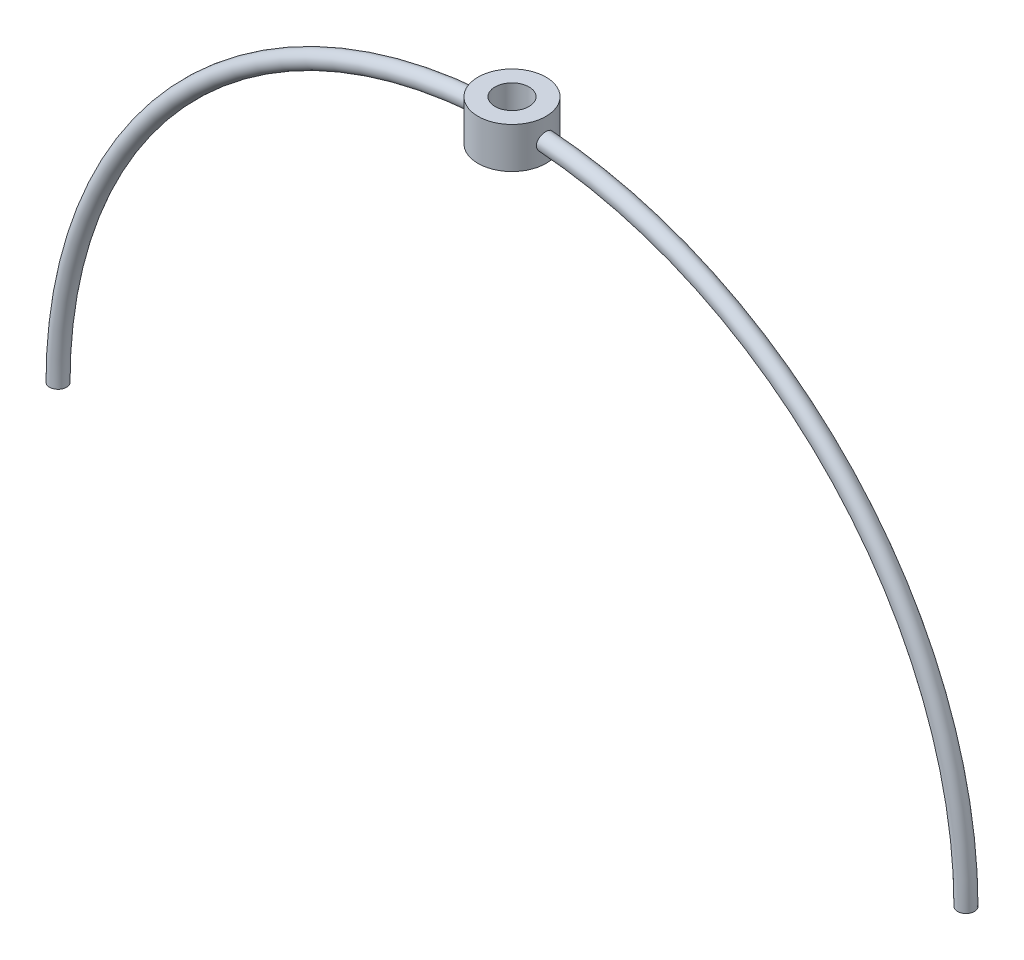
ISO-10303-21;
HEADER;
FILE_DESCRIPTION(('STEP AP214'),'2;1');
FILE_NAME('part.step','',(''),(''),'','','');
FILE_SCHEMA(('AUTOMOTIVE_DESIGN { 1 0 10303 214 1 1 1 1 }'));
ENDSEC;
DATA;
#1=APPLICATION_CONTEXT('core data for automotive mechanical design processes');
#2=APPLICATION_PROTOCOL_DEFINITION('international standard','automotive_design',2000,#1);
#3=PRODUCT_CONTEXT('',#1,'mechanical');
#4=PRODUCT('Part','Part','',(#3));
#5=PRODUCT_RELATED_PRODUCT_CATEGORY('part','',(#4));
#6=PRODUCT_DEFINITION_FORMATION('','',#4);
#7=PRODUCT_DEFINITION_CONTEXT('part definition',#1,'design');
#8=PRODUCT_DEFINITION('design','',#6,#7);
#9=PRODUCT_DEFINITION_SHAPE('','',#8);
#10=(LENGTH_UNIT() NAMED_UNIT(*) SI_UNIT(.MILLI.,.METRE.));
#11=(NAMED_UNIT(*) PLANE_ANGLE_UNIT() SI_UNIT($,.RADIAN.));
#12=(NAMED_UNIT(*) SI_UNIT($,.STERADIAN.) SOLID_ANGLE_UNIT());
#13=UNCERTAINTY_MEASURE_WITH_UNIT(LENGTH_MEASURE(1.E-05),#10,'distance_accuracy_value','');
#14=(GEOMETRIC_REPRESENTATION_CONTEXT(3) GLOBAL_UNCERTAINTY_ASSIGNED_CONTEXT((#13)) GLOBAL_UNIT_ASSIGNED_CONTEXT((#10,
#11,#12)) REPRESENTATION_CONTEXT('',''));
#15=CARTESIAN_POINT('',(0.,0.,0.));
#16=DIRECTION('',(0.,0.,1.));
#17=DIRECTION('',(1.,0.,0.));
#18=AXIS2_PLACEMENT_3D('',#15,#16,#17);
#19=CARTESIAN_POINT('',(0.,-267.,0.));
#20=DIRECTION('',(0.,0.,1.));
#21=DIRECTION('',(1.,0.,0.));
#22=AXIS2_PLACEMENT_3D('',#19,#20,#21);
#23=TOROIDAL_SURFACE('',#22,267.,5.);
#24=CARTESIAN_POINT('',(-19.8558566792347,-5.13977478826469,-2.3968636869233));
#25=CARTESIAN_POINT('',(-19.8843940932087,-5.27144782380629,-2.16043604334639));
#26=CARTESIAN_POINT('',(-19.9099552493875,-5.38402838862671,-1.91296021142055));
#27=CARTESIAN_POINT('',(-19.9524300650434,-5.56725920877616,-1.4021924342394));
#28=CARTESIAN_POINT('',(-19.9693436731426,-5.63790921498252,-1.13890039502525));
#29=CARTESIAN_POINT('',(-19.9926914503923,-5.73472992191784,-0.603439630688587));
#30=CARTESIAN_POINT('',(-19.9991129390298,-5.76084680268452,-0.331260569350999));
#31=CARTESIAN_POINT('',(-20.0007142002762,-5.76739464470261,0.213664533436598));
#32=CARTESIAN_POINT('',(-19.9958948597249,-5.74782921003758,0.486410528462484));
#33=CARTESIAN_POINT('',(-19.97574119007,-5.66454892712558,1.01968767412072));
#34=CARTESIAN_POINT('',(-19.9605939038465,-5.60161920966567,1.28034943861564));
#35=CARTESIAN_POINT('',(-19.9215886245904,-5.43471906347671,1.78747011195748));
#36=CARTESIAN_POINT('',(-19.8977296385545,-5.33074395607818,2.03392739799711));
#37=CARTESIAN_POINT('',(-19.8431690347108,-5.08252849794351,2.51150991578537));
#38=CARTESIAN_POINT('',(-19.8123332902194,-4.93748257006901,2.74220028562752));
#39=CARTESIAN_POINT('',(-19.7472904620689,-4.61242002357268,3.17693551524105));
#40=CARTESIAN_POINT('',(-19.7130825317093,-4.43239461110178,3.38097365302074));
#41=CARTESIAN_POINT('',(-19.6432111099157,-4.03333947935033,3.76620966366136));
#42=CARTESIAN_POINT('',(-19.6075511057081,-3.81292312182426,3.94597376658238));
#43=CARTESIAN_POINT('',(-19.540260501096,-3.34490547491386,4.26675089871441));
#44=CARTESIAN_POINT('',(-19.5086304166132,-3.09730071233345,4.40775896893843));
#45=CARTESIAN_POINT('',(-19.452615617225,-2.57747651579863,4.64880292734323));
#46=CARTESIAN_POINT('',(-19.4283470218217,-2.30494289757578,4.74819072872175));
#47=CARTESIAN_POINT('',(-19.3907716220888,-1.74626298778563,4.89940107800401));
#48=CARTESIAN_POINT('',(-19.3774622380502,-1.46011991655706,4.95123482007417));
#49=CARTESIAN_POINT('',(-19.3638235500661,-0.891517802991517,5.00430514031102));
#50=CARTESIAN_POINT('',(-19.3631173911493,-0.609205139358788,5.00701076495249));
#51=CARTESIAN_POINT('',(-19.3739253320875,-0.0483796352364415,4.96502619139632));
#52=CARTESIAN_POINT('',(-19.3854374247142,0.230133821779043,4.92034377816018));
#53=CARTESIAN_POINT('',(-19.4188579051637,0.767228158505235,4.78669864943589));
#54=CARTESIAN_POINT('',(-19.4404630359377,1.0261500042631,4.69902409791456));
#55=CARTESIAN_POINT('',(-19.4915065053394,1.52536190777954,4.4825742242148));
#56=CARTESIAN_POINT('',(-19.5209453190069,1.76565083448394,4.3537964094126));
#57=CARTESIAN_POINT('',(-19.5846846874444,2.22331108550638,4.05748780135106));
#58=CARTESIAN_POINT('',(-19.6190256473304,2.44046274210971,3.88962678147381));
#59=CARTESIAN_POINT('',(-19.6886300353149,2.84393843135892,3.52038028620137));
#60=CARTESIAN_POINT('',(-19.7238935776284,3.03025862598368,3.31899064328233));
#61=CARTESIAN_POINT('',(-19.7923269616899,3.37109331148008,2.88329385028154));
#62=CARTESIAN_POINT('',(-19.8254345443517,3.52482745551869,2.64836575305738));
#63=CARTESIAN_POINT('',(-19.8850574750467,3.79114838782194,2.1554685066568));
#64=CARTESIAN_POINT('',(-19.9115728753803,3.90373550253765,1.89749954030154));
#65=CARTESIAN_POINT('',(-19.9551087424337,4.0846535678416,1.36558132687681));
#66=CARTESIAN_POINT('',(-19.9721252409761,4.15296602455607,1.09162545396528));
#67=CARTESIAN_POINT('',(-19.9947574865877,4.243229279869,0.535729779044491));
#68=CARTESIAN_POINT('',(-20.0003743423394,4.26518458698272,0.253790756148281));
#69=CARTESIAN_POINT('',(-19.9995919738042,4.26210147609131,-0.3058449866098));
#70=CARTESIAN_POINT('',(-19.9933600504573,4.23771735815012,-0.583545784179696));
#71=CARTESIAN_POINT('',(-19.9698875135685,4.14397061551274,-1.13075994715954));
#72=CARTESIAN_POINT('',(-19.9526468254636,4.07460768617214,-1.40027325710215));
#73=CARTESIAN_POINT('',(-19.9090223758569,3.89293056585302,-1.92347890687889));
#74=CARTESIAN_POINT('',(-19.8826423423211,3.78063388574783,-2.1771776478127));
#75=CARTESIAN_POINT('',(-19.8235530341666,3.51613038192599,-2.66204220179236));
#76=CARTESIAN_POINT('',(-19.7908430899126,3.36391933510132,-2.89320562695465));
#77=CARTESIAN_POINT('',(-19.7221039727865,3.02111982695617,-3.32989856992594));
#78=CARTESIAN_POINT('',(-19.6860346398477,2.83002246653072,-3.53502254096838));
#79=CARTESIAN_POINT('',(-19.614981547484,2.41578398422171,-3.91011860453887));
#80=CARTESIAN_POINT('',(-19.5799978044162,2.19264237979864,-4.08009016762894));
#81=CARTESIAN_POINT('',(-19.515073359117,1.72000075156805,-4.38013505953025));
#82=CARTESIAN_POINT('',(-19.4851371029088,1.47047780152085,-4.51017329544998));
#83=CARTESIAN_POINT('',(-19.4338756142997,0.952227026667946,-4.72619228216156));
#84=CARTESIAN_POINT('',(-19.4125487878018,0.683502767976308,-4.81218118979327));
#85=CARTESIAN_POINT('',(-19.3813903626495,0.140660645514759,-4.93616664658288));
#86=CARTESIAN_POINT('',(-19.3713218364114,-0.133217616795741,-4.97515376938546));
#87=CARTESIAN_POINT('',(-19.3629763332636,-0.683807668266718,-5.00753851779471));
#88=CARTESIAN_POINT('',(-19.3646984922077,-0.960519248287473,-5.00093948443705));
#89=CARTESIAN_POINT('',(-19.3795429035588,-1.50619822651781,-4.94309186973727));
#90=CARTESIAN_POINT('',(-19.3925561797823,-1.7752143337346,-4.89227009066053));
#91=CARTESIAN_POINT('',(-19.4282580819616,-2.30107995553048,-4.74849648126612));
#92=CARTESIAN_POINT('',(-19.450948882073,-2.55792672172594,-4.65553518357602));
#93=CARTESIAN_POINT('',(-19.5041832379835,-3.05969893109056,-4.42728863292985));
#94=CARTESIAN_POINT('',(-19.5349232799862,-3.3041113445727,-4.29092275335443));
#95=CARTESIAN_POINT('',(-19.6005197321358,-3.76706750666961,-3.98054025538962));
#96=CARTESIAN_POINT('',(-19.6353757302926,-3.98561383999376,-3.80652740385659));
#97=CARTESIAN_POINT('',(-19.7029770007677,-4.3768311282681,-3.43876083262377));
#98=CARTESIAN_POINT('',(-19.7356960793594,-4.55165934692548,-3.24729132827937));
#99=CARTESIAN_POINT('',(-19.7984718618213,-4.87008330020921,-2.83954407374087));
#100=CARTESIAN_POINT('',(-19.8285289150108,-5.01368313633007,-2.62326958710629));
#101=CARTESIAN_POINT('',(-19.8558566792347,-5.13977478826469,-2.3968636869233));
#102=B_SPLINE_CURVE_WITH_KNOTS('',3,(#24,#25,#26,#27,#28,#29,#30,#31,#32,#33,#34,#35,#36,#37,
#38,#39,#40,#41,#42,#43,#44,#45,#46,#47,#48,#49,#50,#51,#52,#53,#54,#55,#56,#57,#58,#59,#60,#61,
#62,#63,#64,#65,#66,#67,#68,#69,#70,#71,#72,#73,#74,#75,#76,#77,#78,#79,#80,#81,#82,#83,#84,#85,
#86,#87,#88,#89,#90,#91,#92,#93,#94,#95,#96,#97,#98,#99,#100,#101),.UNSPECIFIED.,.T.,.F.,(4,2,2,
2,2,2,2,2,2,2,2,2,2,2,2,2,2,2,2,2,2,2,2,2,2,2,2,2,2,2,2,2,2,2,2,2,2,2,4),(0.,0.815492485813612,
1.63098981667689,2.44747201013743,3.26388978981821,4.06590146330171,4.86800458265879,
5.68708286511368,6.50636733105496,7.3623759281503,8.21849400397939,9.08748750742063,
9.95627639834583,10.7990422006925,11.6416695739446,12.4604641708282,13.2793084312814,
14.1053399619844,14.9314742430981,15.7755858799662,16.6196908197013,17.4641481218718,
18.3085232916405,19.1410646258288,19.9736115989327,20.8058193727155,21.6381152331355,
22.4820985845795,23.3260946465131,24.1708302926918,25.0154094582459,25.8418590316785,
26.6682480347879,27.4867487652216,28.3054334772254,29.1463466892656,29.9871758006368,
30.7682036650913,31.5491288883426),.UNSPECIFIED.);
#103=CARTESIAN_POINT('',(-19.8558566792347,-5.13977478826469,-2.3968636869233));
#104=VERTEX_POINT('',#103);
#105=EDGE_CURVE('E114',#104,#104,#102,.T.);
#106=ORIENTED_EDGE('',*,*,#105,.T.);
#107=EDGE_LOOP('',(#106));
#108=FACE_BOUND('',#107,.T.);
#109=CARTESIAN_POINT('',(-267.,-267.,0.));
#110=DIRECTION('',(0.,1.,0.));
#111=DIRECTION('',(0.,0.,-1.));
#112=AXIS2_PLACEMENT_3D('',#109,#110,#111);
#113=CIRCLE('',#112,5.);
#114=CARTESIAN_POINT('',(-267.,-267.,-5.));
#115=VERTEX_POINT('',#114);
#116=EDGE_CURVE('E66',#115,#115,#113,.T.);
#117=ORIENTED_EDGE('',*,*,#116,.T.);
#118=EDGE_LOOP('',(#117));
#119=FACE_BOUND('',#118,.T.);
#120=ADVANCED_FACE('F39',(#108,#119),#23,.T.);
#121=CARTESIAN_POINT('',(0.,-267.,0.));
#122=DIRECTION('',(0.,0.,1.));
#123=DIRECTION('',(1.,0.,0.));
#124=AXIS2_PLACEMENT_3D('',#121,#122,#123);
#125=TOROIDAL_SURFACE('',#124,267.,3.);
#126=CARTESIAN_POINT('',(-19.9444777476599,-3.35758524978057,-1.48923046339338));
#127=CARTESIAN_POINT('',(-19.9334674717532,-3.27219185162063,-1.63666877254863));
#128=CARTESIAN_POINT('',(-19.9213461594175,-3.17418069360779,-1.77684558395535));
#129=CARTESIAN_POINT('',(-19.8962543259344,-2.95590010042962,-2.03873980847371));
#130=CARTESIAN_POINT('',(-19.8832827782903,-2.83560342758394,-2.16043429737974));
#131=CARTESIAN_POINT('',(-19.8579728896269,-2.57636843660325,-2.38187765962171));
#132=CARTESIAN_POINT('',(-19.8456340486863,-2.43744515975818,-2.48164407044328));
#133=CARTESIAN_POINT('',(-19.8229755436596,-2.14479298846647,-2.6565864609076));
#134=CARTESIAN_POINT('',(-19.8126553585246,-1.99106792993525,-2.73176878948775));
#135=CARTESIAN_POINT('',(-19.7951832165943,-1.67243989864651,-2.85563880671687));
#136=CARTESIAN_POINT('',(-19.7880432718991,-1.50749721335644,-2.90422619896277));
#137=CARTESIAN_POINT('',(-19.7778420900555,-1.17165152700827,-2.97290878360131));
#138=CARTESIAN_POINT('',(-19.7747806871847,-1.00074876841401,-2.99300513366594));
#139=CARTESIAN_POINT('',(-19.773134495077,-0.66016070583637,-3.00386111066936));
#140=CARTESIAN_POINT('',(-19.7744934266305,-0.490487448330443,-2.99498954833695));
#141=CARTESIAN_POINT('',(-19.7814296834904,-0.155144063511982,-2.94882631130559));
#142=CARTESIAN_POINT('',(-19.787006704001,0.0105263521502106,-2.91153669007183));
#143=CARTESIAN_POINT('',(-19.8016549511313,0.331082968983564,-2.81016492375275));
#144=CARTESIAN_POINT('',(-19.8106832938964,0.486075005909743,-2.74641080559001));
#145=CARTESIAN_POINT('',(-19.8312216570137,0.783071034003262,-2.5939423571745));
#146=CARTESIAN_POINT('',(-19.8427316993711,0.925074909989715,-2.50522780559743));
#147=CARTESIAN_POINT('',(-19.86695985771,1.19233660133368,-2.3052187821512));
#148=CARTESIAN_POINT('',(-19.8796795028743,1.31757272429994,-2.19389552096793));
#149=CARTESIAN_POINT('',(-19.9048990094883,1.54768033380063,-1.95186286650414));
#150=CARTESIAN_POINT('',(-19.9173988625749,1.65255104694485,-1.82115273732653));
#151=CARTESIAN_POINT('',(-19.940875598928,1.83971272867435,-1.54306446388304));
#152=CARTESIAN_POINT('',(-19.9518418696701,1.92184986952628,-1.39558185902703));
#153=CARTESIAN_POINT('',(-19.9709311458209,2.06036609375574,-1.08880835991596));
#154=CARTESIAN_POINT('',(-19.9790541530138,2.11674519329721,-0.929517473071026));
#155=CARTESIAN_POINT('',(-19.9915589534151,2.2022239436843,-0.603482163728312));
#156=CARTESIAN_POINT('',(-19.9959374294645,2.23129940935435,-0.436731269951043));
#157=CARTESIAN_POINT('',(-20.0004525302974,2.2612687100837,-0.100660753845513));
#158=CARTESIAN_POINT('',(-20.0005892270132,2.26216302303904,0.0686588248742689));
#159=CARTESIAN_POINT('',(-19.9966112488473,2.23578218475202,0.404579233724547));
#160=CARTESIAN_POINT('',(-19.9925079590123,2.20858247057831,0.571186130721185));
#161=CARTESIAN_POINT('',(-19.980522687774,2.1268875918843,0.897425769633702));
#162=CARTESIAN_POINT('',(-19.972640655909,2.07239206285191,1.05705841838355));
#163=CARTESIAN_POINT('',(-19.9539625420232,1.93754455280067,1.36499796869973));
#164=CARTESIAN_POINT('',(-19.9431636873192,1.85716795563044,1.51329392080909));
#165=CARTESIAN_POINT('',(-19.9198554304926,1.67277114856174,1.79422884168375));
#166=CARTESIAN_POINT('',(-19.9073459916294,1.56875043079399,1.92686747404109));
#167=CARTESIAN_POINT('',(-19.8819844919911,1.33964275839593,2.17303251159056));
#168=CARTESIAN_POINT('',(-19.8691317192539,1.21450861520785,2.28651494024865));
#169=CARTESIAN_POINT('',(-19.8445642050143,0.946800542265269,2.49076002155908));
#170=CARTESIAN_POINT('',(-19.8328494272717,0.804227168202392,2.58152339786107));
#171=CARTESIAN_POINT('',(-19.8119333773113,0.506218761255956,2.73742351309653));
#172=CARTESIAN_POINT('',(-19.8027227297931,0.350834621984267,2.8026562520795));
#173=CARTESIAN_POINT('',(-19.7878037660019,0.0311704361326679,2.90612749266802));
#174=CARTESIAN_POINT('',(-19.782095261391,-0.133109131552715,2.94436744590529));
#175=CARTESIAN_POINT('',(-19.7748437105285,-0.464799091921624,2.99268393478277));
#176=CARTESIAN_POINT('',(-19.7732750409593,-0.63218373723768,3.00293372802264));
#177=CARTESIAN_POINT('',(-19.7743841040748,-0.966324113993612,2.99562078167413));
#178=CARTESIAN_POINT('',(-19.7770619247008,-1.13307983233724,2.97805746609936));
#179=CARTESIAN_POINT('',(-19.78635785679,-1.46200532124528,2.9156523246265));
#180=CARTESIAN_POINT('',(-19.7929923870801,-1.62415301625277,2.87069681467451));
#181=CARTESIAN_POINT('',(-19.8094535898927,-1.93871095779186,2.75480517750938));
#182=CARTESIAN_POINT('',(-19.8192805808835,-2.0911202310375,2.68386645821436));
#183=CARTESIAN_POINT('',(-19.8411959595285,-2.38427719659041,2.51676824987635));
#184=CARTESIAN_POINT('',(-19.8533157996762,-2.52481779376118,2.42024943205852));
#185=CARTESIAN_POINT('',(-19.8783565456399,-2.78778023448153,2.20513840577177));
#186=CARTESIAN_POINT('',(-19.8912775057705,-2.91020084761719,2.08654469956957));
#187=CARTESIAN_POINT('',(-19.9165664271559,-3.13424333236444,1.82951987926658));
#188=CARTESIAN_POINT('',(-19.928929744823,-3.23570934571231,1.69095227577018));
#189=CARTESIAN_POINT('',(-19.9515878461411,-3.41361743286353,1.39843547934434));
#190=CARTESIAN_POINT('',(-19.9618828768752,-3.49006249642335,1.24448812701441));
#191=CARTESIAN_POINT('',(-19.9790864509289,-3.6145636356622,0.927832003383753));
#192=CARTESIAN_POINT('',(-19.9860405548795,-3.66300359417857,0.765276773480945));
#193=CARTESIAN_POINT('',(-19.9959727935167,-3.73150696886169,0.434143339196063));
#194=CARTESIAN_POINT('',(-19.9989507140813,-3.75156885683994,0.265564810954282));
#195=CARTESIAN_POINT('',(-20.0005664158284,-3.76249694562767,-0.0689918899567632));
#196=CARTESIAN_POINT('',(-19.999293865613,-3.75396632517443,-0.234950497894562));
#197=CARTESIAN_POINT('',(-19.9927480475352,-3.70932209423292,-0.562911463384697));
#198=CARTESIAN_POINT('',(-19.9874788543338,-3.67323657628611,-0.72491767696589));
#199=CARTESIAN_POINT('',(-19.9758458539948,-3.59103708862254,-0.988358866905755));
#200=CARTESIAN_POINT('',(-19.9704156170496,-3.55215135753872,-1.09215474137977));
#201=CARTESIAN_POINT('',(-19.9583055949413,-3.46314487378962,-1.2947307567935));
#202=CARTESIAN_POINT('',(-19.9516258130925,-3.4130241509247,-1.39351091103636));
#203=CARTESIAN_POINT('',(-19.9444777476599,-3.35758524978057,-1.48923046339338));
#204=B_SPLINE_CURVE_WITH_KNOTS('',3,(#126,#127,#128,#129,#130,#131,#132,#133,#134,#135,#136,
#137,#138,#139,#140,#141,#142,#143,#144,#145,#146,#147,#148,#149,#150,#151,#152,#153,#154,#155,
#156,#157,#158,#159,#160,#161,#162,#163,#164,#165,#166,#167,#168,#169,#170,#171,#172,#173,#174,
#175,#176,#177,#178,#179,#180,#181,#182,#183,#184,#185,#186,#187,#188,#189,#190,#191,#192,#193,
#194,#195,#196,#197,#198,#199,#200,#201,#202,#203),.UNSPECIFIED.,.T.,.F.,(4,2,2,2,2,2,2,2,2,2,2,
2,2,2,2,2,2,2,2,2,2,2,2,2,2,2,2,2,2,2,2,2,2,2,2,2,2,2,4),(0.,0.511803208231407,1.02423612689562,
1.53625771209649,2.04814696105178,2.56195360495626,3.07573937083885,3.58300940250913,
4.09024278274577,4.59136835186553,5.09249836460848,5.59427054938984,6.09606178558466,
6.60116972785299,7.10627735315038,7.61183197482302,8.11737802329486,8.62157011790308,
9.12576894574203,9.63044875368201,10.1351394030313,10.6409733526747,11.1467911883911,
11.6506883473374,12.1545584053818,12.6553023881117,13.1560567409695,13.6589036334203,
14.161800703486,14.6721754543059,15.1825848455754,15.6966637781808,16.210681260985,
16.7174746824968,17.2242953943207,17.720492236814,18.2161838751066,18.5484564317384,
18.880728107041),.UNSPECIFIED.);
#205=CARTESIAN_POINT('',(-19.9444777476599,-3.35758524978057,-1.48923046339338));
#206=VERTEX_POINT('',#205);
#207=EDGE_CURVE('E44',#206,#206,#204,.T.);
#208=ORIENTED_EDGE('',*,*,#207,.T.);
#209=EDGE_LOOP('',(#208));
#210=FACE_BOUND('',#209,.T.);
#211=CARTESIAN_POINT('',(-267.,-267.,0.));
#212=DIRECTION('',(0.,1.,0.));
#213=DIRECTION('',(0.,0.,-1.));
#214=AXIS2_PLACEMENT_3D('',#211,#212,#213);
#215=CIRCLE('',#214,3.);
#216=CARTESIAN_POINT('',(-267.,-267.,-3.));
#217=VERTEX_POINT('',#216);
#218=EDGE_CURVE('E11',#217,#217,#215,.F.);
#219=ORIENTED_EDGE('',*,*,#218,.T.);
#220=EDGE_LOOP('',(#219));
#221=FACE_BOUND('',#220,.T.);
#222=ADVANCED_FACE('F73',(#210,#221),#125,.F.);
#223=CARTESIAN_POINT('',(-267.,-267.,0.));
#224=DIRECTION('',(0.,1.,0.));
#225=DIRECTION('',(0.,0.,-1.));
#226=AXIS2_PLACEMENT_3D('',#223,#224,#225);
#227=PLANE('',#226);
#228=ORIENTED_EDGE('',*,*,#218,.F.);
#229=EDGE_LOOP('',(#228));
#230=FACE_BOUND('',#229,.T.);
#231=ORIENTED_EDGE('',*,*,#116,.F.);
#232=EDGE_LOOP('',(#231));
#233=FACE_BOUND('',#232,.T.);
#234=ADVANCED_FACE('F75',(#230,#233),#227,.F.);
#235=CARTESIAN_POINT('',(0.,-12.,0.));
#236=DIRECTION('',(0.,1.,0.));
#237=DIRECTION('',(0.,0.,1.));
#238=AXIS2_PLACEMENT_3D('',#235,#236,#237);
#239=CYLINDRICAL_SURFACE('',#238,20.);
#240=ORIENTED_EDGE('',*,*,#207,.F.);
#241=EDGE_LOOP('',(#240));
#242=FACE_BOUND('',#241,.T.);
#243=ADVANCED_FACE('F77',(#242),#239,.T.);
#244=CARTESIAN_POINT('',(19.8558566792347,-5.1397747882647,-2.39686368692331));
#245=CARTESIAN_POINT('',(19.8407457925973,-5.0700538176607,-2.52205040445424));
#246=CARTESIAN_POINT('',(19.8248055866448,-4.9949932380026,-2.64412713302455));
#247=CARTESIAN_POINT('',(19.7917235166022,-4.83480311734881,-2.88132504920793));
#248=CARTESIAN_POINT('',(19.7745813681774,-4.74967119055283,-2.99644457893372));
#249=CARTESIAN_POINT('',(19.7220503496396,-4.47998955399404,-3.33037739952749));
#250=CARTESIAN_POINT('',(19.6855583873272,-4.28116053074759,-3.53775323557462));
#251=CARTESIAN_POINT('',(19.6138270852357,-3.85172703552723,-3.91599086853255));
#252=CARTESIAN_POINT('',(19.5785865887783,-3.62115291936987,-4.08688715504977));
#253=CARTESIAN_POINT('',(19.5133039916121,-3.13416872818195,-4.38802233339629));
#254=CARTESIAN_POINT('',(19.483260616708,-2.87776501034267,-4.51827119720195));
#255=CARTESIAN_POINT('',(19.4318155835827,-2.34478091697871,-4.73466592606082));
#256=CARTESIAN_POINT('',(19.4104527779208,-2.0681162306456,-4.82061395952632));
#257=CARTESIAN_POINT('',(19.3793028080088,-1.50358126031438,-4.94436743069361));
#258=CARTESIAN_POINT('',(19.3695131614778,-1.21571339292915,-4.982183192229));
#259=CARTESIAN_POINT('',(19.362994668585,-0.647282030469983,-5.00745335195744));
#260=CARTESIAN_POINT('',(19.3658400227735,-0.366796174354934,-4.99654952185353));
#261=CARTESIAN_POINT('',(19.3833851810443,0.188018127606856,-4.92804347272924));
#262=CARTESIAN_POINT('',(19.3980834444915,0.4623473689245,-4.87044732274778));
#263=CARTESIAN_POINT('',(19.4371419754943,0.990337487674545,-4.71210320441219));
#264=CARTESIAN_POINT('',(19.4612643120927,1.24433462341004,-4.61241332200121));
#265=CARTESIAN_POINT('',(19.5164610910974,1.73184955656823,-4.37295937363192));
#266=CARTESIAN_POINT('',(19.5475360836696,1.9653657312897,-4.23319213609388));
#267=CARTESIAN_POINT('',(19.6136758952229,2.40882141491616,-3.91539538845372));
#268=CARTESIAN_POINT('',(19.648787881663,2.61840980943542,-3.73688608272833));
#269=CARTESIAN_POINT('',(19.7188427906404,3.00512955833039,-3.34757968787995));
#270=CARTESIAN_POINT('',(19.7537856928228,3.18225709516336,-3.13677880646764));
#271=CARTESIAN_POINT('',(19.8204410694669,3.50279001006894,-2.68392504919875));
#272=CARTESIAN_POINT('',(19.8520743522172,3.64544475300436,-2.44132847237939));
#273=CARTESIAN_POINT('',(19.9078021668911,3.88845453677991,-1.93499637911485));
#274=CARTESIAN_POINT('',(19.9318969458276,3.98881096363959,-1.671261555659));
#275=CARTESIAN_POINT('',(19.9698295769607,4.14412494883781,-1.130920009968));
#276=CARTESIAN_POINT('',(19.9836991787484,4.19922309733363,-0.854355990260173));
#277=CARTESIAN_POINT('',(19.9997674120062,4.26289434429347,-0.295600267571134));
#278=CARTESIAN_POINT('',(20.00196710107,4.27147165874077,-0.013409076882701));
#279=CARTESIAN_POINT('',(19.9945069888748,4.24205570627117,0.544515469778555));
#280=CARTESIAN_POINT('',(19.9850077036801,4.20469277493119,0.82028449573684));
#281=CARTESIAN_POINT('',(19.9554477984487,4.08555812663381,1.36146120204604));
#282=CARTESIAN_POINT('',(19.935386908064,4.00378527290308,1.62686861698146));
#283=CARTESIAN_POINT('',(19.8867904538076,3.79787237354181,2.14064925334442));
#284=CARTESIAN_POINT('',(19.8582333330088,3.6736244377086,2.38897714272729));
#285=CARTESIAN_POINT('',(19.7957164476048,3.38613282046689,2.86119112383205));
#286=CARTESIAN_POINT('',(19.7617560943758,3.2228848894576,3.08507454810771));
#287=CARTESIAN_POINT('',(19.6915853678785,2.85903372628967,3.5053623346428));
#288=CARTESIAN_POINT('',(19.6553500918103,2.65793803253139,3.70133658049156));
#289=CARTESIAN_POINT('',(19.5851325481891,2.22519154486871,4.05653182624586));
#290=CARTESIAN_POINT('',(19.551150239203,1.99354131310988,4.21575350218082));
#291=CARTESIAN_POINT('',(19.4894445362364,1.50659361550201,4.49240125262387));
#292=CARTESIAN_POINT('',(19.4617035868494,1.25136539917471,4.60994510763421));
#293=CARTESIAN_POINT('',(19.4156396497175,0.723949091424435,4.80027183103796));
#294=CARTESIAN_POINT('',(19.3973148620911,0.451764252388837,4.87306325429681));
#295=CARTESIAN_POINT('',(19.37253852282,-0.0952499645625325,4.97063873318784));
#296=CARTESIAN_POINT('',(19.3658290715762,-0.369882008073213,4.99646622018239));
#297=CARTESIAN_POINT('',(19.3641795612146,-0.919684727401026,5.00285532199856));
#298=CARTESIAN_POINT('',(19.3692391883534,-1.19485538866414,4.98341814349841));
#299=CARTESIAN_POINT('',(19.3903710886102,-1.73669524407936,4.90053914296711));
#300=CARTESIAN_POINT('',(19.4063923062865,-2.00339787883591,4.83730131302119));
#301=CARTESIAN_POINT('',(19.4474968621872,-2.52264792132087,4.6692909540676));
#302=CARTESIAN_POINT('',(19.4725818171587,-2.77519279436406,4.56451101464744));
#303=CARTESIAN_POINT('',(19.5299201473885,-3.26731517353562,4.31269879070111));
#304=CARTESIAN_POINT('',(19.5623707953929,-3.50625227920314,4.16446273704626));
#305=CARTESIAN_POINT('',(19.6303962656974,-3.95646776244421,3.83097408897174));
#306=CARTESIAN_POINT('',(19.6659717580543,-4.16774018360055,3.64571354451745));
#307=CARTESIAN_POINT('',(19.7192637183443,-4.46225068792237,3.34091646178288));
#308=CARTESIAN_POINT('',(19.7372678589206,-4.55786249525037,3.23312076854437));
#309=CARTESIAN_POINT('',(19.7725696486883,-4.73956485067339,3.00969431259224));
#310=CARTESIAN_POINT('',(19.7898675621743,-4.82565898159797,2.8940665248049));
#311=CARTESIAN_POINT('',(19.8232652917333,-4.9876768378716,2.65568171472356));
#312=CARTESIAN_POINT('',(19.8393647260609,-5.06359732877224,2.53292244285439));
#313=CARTESIAN_POINT('',(19.8698838978781,-5.20457371520055,2.28117910681386));
#314=CARTESIAN_POINT('',(19.8843043562866,-5.26963427900681,2.15219774818006));
#315=CARTESIAN_POINT('',(19.9108094076623,-5.38729565628849,1.89118276132801));
#316=CARTESIAN_POINT('',(19.9229305420596,-5.44009503576811,1.75924237951013));
#317=CARTESIAN_POINT('',(19.9447851949654,-5.53416072832261,1.49117942674135));
#318=CARTESIAN_POINT('',(19.9545197377611,-5.57543199014627,1.35505867826311));
#319=CARTESIAN_POINT('',(19.9713192960496,-5.64607122535179,1.07956192060419));
#320=CARTESIAN_POINT('',(19.9783836363389,-5.6754361881715,0.940185097520601));
#321=CARTESIAN_POINT('',(19.9896222165813,-5.72193314274789,0.65934863068626));
#322=CARTESIAN_POINT('',(19.9937977106362,-5.7390704428605,0.517889917994647));
#323=CARTESIAN_POINT('',(19.9990164132699,-5.7604611141097,0.240304205438673));
#324=CARTESIAN_POINT('',(20.0001911381472,-5.76525552199217,0.10422111783625));
#325=CARTESIAN_POINT('',(19.9997583126442,-5.7634859878705,-0.167813072514285));
#326=CARTESIAN_POINT('',(19.9981518681193,-5.75692656040666,-0.303764206225139));
#327=CARTESIAN_POINT('',(19.9922044648355,-5.73252567215721,-0.574529809218268));
#328=CARTESIAN_POINT('',(19.9878647642525,-5.71468940232726,-0.709344772583898));
#329=CARTESIAN_POINT('',(19.9765772551194,-5.66792558629902,-0.976885957386107));
#330=CARTESIAN_POINT('',(19.9696298161127,-5.63899961161368,-1.10961247200196));
#331=CARTESIAN_POINT('',(19.9489250600102,-5.55184888575851,-1.44262207681378));
#332=CARTESIAN_POINT('',(19.9335142231105,-5.48623193399641,-1.64091359216335));
#333=CARTESIAN_POINT('',(19.8979359013601,-5.3307448445879,-2.02727138078955));
#334=CARTESIAN_POINT('',(19.8777681681996,-5.24087344082409,-2.21533711964995));
#335=CARTESIAN_POINT('',(19.8558566792347,-5.1397747882647,-2.39686368692331));
#336=B_SPLINE_CURVE_WITH_KNOTS('',3,(#244,#245,#246,#247,#248,#249,#250,#251,#252,#253,#254,
#255,#256,#257,#258,#259,#260,#261,#262,#263,#264,#265,#266,#267,#268,#269,#270,#271,#272,#273,
#274,#275,#276,#277,#278,#279,#280,#281,#282,#283,#284,#285,#286,#287,#288,#289,#290,#291,#292,
#293,#294,#295,#296,#297,#298,#299,#300,#301,#302,#303,#304,#305,#306,#307,#308,#309,#310,#311,
#312,#313,#314,#315,#316,#317,#318,#319,#320,#321,#322,#323,#324,#325,#326,#327,#328,#329,#330,
#331,#332,#333,#334,#335),.UNSPECIFIED.,.T.,.F.,(4,2,2,2,2,2,2,2,2,2,2,2,2,2,2,2,2,2,2,2,2,2,2,
2,2,2,2,2,2,2,2,2,2,2,2,2,2,2,2,2,2,2,2,2,2,4),(0.,0.432059069735834,0.864220695618801,
1.72858385340376,2.59212614315916,3.45545641442691,4.32260931556849,5.18957619075807,
6.02755215459941,6.86541921630222,7.68337337948734,8.50139229053636,9.33018744316664,
10.15908000337,11.0046588405632,11.8502099679078,12.6931244375174,13.5359625161341,
14.3673641504295,15.1987870673503,16.032337754999,16.8659793112385,17.7113295924071,
18.5566643229021,19.3995907525456,20.2423559984085,21.0661568360537,21.8899357128354,
22.7099035899544,23.5300178013866,24.3754326670488,25.2210292587132,25.6562217604406,
26.0912498766186,26.5264159723687,26.9613945219665,27.3887419249473,27.8159055948518,
28.2431772077858,28.670263217621,29.0782822963305,29.4861391747441,29.8938084450508,
30.301419966221,30.9278930185326,31.5543987799692),.UNSPECIFIED.);
#337=CARTESIAN_POINT('',(19.8558566792347,-5.1397747882647,-2.39686368692331));
#338=VERTEX_POINT('',#337);
#339=EDGE_CURVE('E112',#338,#338,#336,.T.);
#340=ORIENTED_EDGE('',*,*,#339,.F.);
#341=EDGE_LOOP('',(#340));
#342=FACE_BOUND('',#341,.T.);
#343=CARTESIAN_POINT('',(0.,-12.,0.));
#344=DIRECTION('',(0.,1.,0.));
#345=DIRECTION('',(0.,0.,1.));
#346=AXIS2_PLACEMENT_3D('',#343,#344,#345);
#347=CIRCLE('',#346,20.);
#348=CARTESIAN_POINT('',(0.,-12.,20.));
#349=VERTEX_POINT('',#348);
#350=EDGE_CURVE('E126',#349,#349,#347,.T.);
#351=ORIENTED_EDGE('',*,*,#350,.T.);
#352=EDGE_LOOP('',(#351));
#353=FACE_BOUND('',#352,.T.);
#354=CARTESIAN_POINT('',(0.,12.,0.));
#355=DIRECTION('',(0.,1.,0.));
#356=DIRECTION('',(0.,0.,1.));
#357=AXIS2_PLACEMENT_3D('',#354,#355,#356);
#358=CIRCLE('',#357,20.);
#359=CARTESIAN_POINT('',(0.,12.,20.));
#360=VERTEX_POINT('',#359);
#361=EDGE_CURVE('E171',#360,#360,#358,.T.);
#362=ORIENTED_EDGE('',*,*,#361,.F.);
#363=EDGE_LOOP('',(#362));
#364=FACE_BOUND('',#363,.T.);
#365=ORIENTED_EDGE('',*,*,#105,.F.);
#366=EDGE_LOOP('',(#365));
#367=FACE_BOUND('',#366,.T.);
#368=ADVANCED_FACE('F84',(#342,#353,#364,#367),#239,.T.);
#369=CARTESIAN_POINT('',(0.,-12.,0.));
#370=DIRECTION('',(0.,1.,0.));
#371=DIRECTION('',(0.,0.,1.));
#372=AXIS2_PLACEMENT_3D('',#369,#370,#371);
#373=PLANE('',#372);
#374=CARTESIAN_POINT('',(0.,-12.,0.));
#375=DIRECTION('',(0.,1.,0.));
#376=DIRECTION('',(0.,0.,1.));
#377=AXIS2_PLACEMENT_3D('',#374,#375,#376);
#378=CIRCLE('',#377,10.);
#379=CARTESIAN_POINT('',(0.,-12.,10.));
#380=VERTEX_POINT('',#379);
#381=EDGE_CURVE('E168',#380,#380,#378,.T.);
#382=ORIENTED_EDGE('',*,*,#381,.T.);
#383=EDGE_LOOP('',(#382));
#384=FACE_BOUND('',#383,.T.);
#385=ORIENTED_EDGE('',*,*,#350,.F.);
#386=EDGE_LOOP('',(#385));
#387=FACE_BOUND('',#386,.T.);
#388=ADVANCED_FACE('F106',(#384,#387),#373,.F.);
#389=CARTESIAN_POINT('',(0.,12.,0.));
#390=DIRECTION('',(0.,1.,0.));
#391=DIRECTION('',(0.,0.,1.));
#392=AXIS2_PLACEMENT_3D('',#389,#390,#391);
#393=PLANE('',#392);
#394=CARTESIAN_POINT('',(0.,12.,0.));
#395=DIRECTION('',(0.,1.,0.));
#396=DIRECTION('',(0.,0.,1.));
#397=AXIS2_PLACEMENT_3D('',#394,#395,#396);
#398=CIRCLE('',#397,10.);
#399=CARTESIAN_POINT('',(0.,12.,10.));
#400=VERTEX_POINT('',#399);
#401=EDGE_CURVE('E165',#400,#400,#398,.T.);
#402=ORIENTED_EDGE('',*,*,#401,.F.);
#403=EDGE_LOOP('',(#402));
#404=FACE_BOUND('',#403,.T.);
#405=ORIENTED_EDGE('',*,*,#361,.T.);
#406=EDGE_LOOP('',(#405));
#407=FACE_BOUND('',#406,.T.);
#408=ADVANCED_FACE('F98',(#404,#407),#393,.T.);
#409=ORIENTED_EDGE('',*,*,#339,.T.);
#410=EDGE_LOOP('',(#409));
#411=FACE_BOUND('',#410,.T.);
#412=CARTESIAN_POINT('',(267.,-267.,0.));
#413=DIRECTION('',(0.,-1.,0.));
#414=DIRECTION('',(0.,0.,-1.));
#415=AXIS2_PLACEMENT_3D('',#412,#413,#414);
#416=CIRCLE('',#415,5.);
#417=CARTESIAN_POINT('',(267.,-267.,-5.));
#418=VERTEX_POINT('',#417);
#419=EDGE_CURVE('E61',#418,#418,#416,.T.);
#420=ORIENTED_EDGE('',*,*,#419,.F.);
#421=EDGE_LOOP('',(#420));
#422=FACE_BOUND('',#421,.T.);
#423=ADVANCED_FACE('F41',(#411,#422),#23,.T.);
#424=CARTESIAN_POINT('',(267.,-267.,0.));
#425=DIRECTION('',(0.,-1.,0.));
#426=DIRECTION('',(0.,0.,-1.));
#427=AXIS2_PLACEMENT_3D('',#424,#425,#426);
#428=PLANE('',#427);
#429=CARTESIAN_POINT('',(267.,-267.,0.));
#430=DIRECTION('',(0.,-1.,0.));
#431=DIRECTION('',(0.,0.,-1.));
#432=AXIS2_PLACEMENT_3D('',#429,#430,#431);
#433=CIRCLE('',#432,3.);
#434=CARTESIAN_POINT('',(267.,-267.,-3.));
#435=VERTEX_POINT('',#434);
#436=EDGE_CURVE('E55',#435,#435,#433,.F.);
#437=ORIENTED_EDGE('',*,*,#436,.T.);
#438=EDGE_LOOP('',(#437));
#439=FACE_BOUND('',#438,.T.);
#440=ORIENTED_EDGE('',*,*,#419,.T.);
#441=EDGE_LOOP('',(#440));
#442=FACE_BOUND('',#441,.T.);
#443=ADVANCED_FACE('F97',(#439,#442),#428,.T.);
#444=CARTESIAN_POINT('',(19.9444777476599,-3.35758524978054,-1.48923046339336));
#445=CARTESIAN_POINT('',(19.9551801375956,-3.44059969224423,-1.34587449303735));
#446=CARTESIAN_POINT('',(19.9648438834023,-3.51178194574228,-1.19549308368632));
#447=CARTESIAN_POINT('',(19.9810269422996,-3.62821231290042,-0.884748248905388));
#448=CARTESIAN_POINT('',(19.9875440814869,-3.67344250104902,-0.724378008582951));
#449=CARTESIAN_POINT('',(19.9967020299152,-3.73644699580314,-0.398147220615305));
#450=CARTESIAN_POINT('',(19.9993415341402,-3.75421205914048,-0.232284843789093));
#451=CARTESIAN_POINT('',(20.000439895784,-3.76164154725731,0.100051869394297));
#452=CARTESIAN_POINT('',(19.9988995209911,-3.75131113280277,0.266526087754657));
#453=CARTESIAN_POINT('',(19.9918478021057,-3.70314144943742,0.593782301662065));
#454=CARTESIAN_POINT('',(19.9863730458319,-3.66555561361272,0.754602525604535));
#455=CARTESIAN_POINT('',(19.9720962254917,-3.56438594974208,1.06768545974142));
#456=CARTESIAN_POINT('',(19.9632939152512,-3.50080019818168,1.21994753584247));
#457=CARTESIAN_POINT('',(19.9432174618544,-3.34886532621164,1.51324696185563));
#458=CARTESIAN_POINT('',(19.9319203766874,-3.26028409588807,1.65416237668942));
#459=CARTESIAN_POINT('',(19.9081253875709,-3.06122535832976,1.91945672964424));
#460=CARTESIAN_POINT('',(19.8956273331119,-2.95074510478841,2.04383359043086));
#461=CARTESIAN_POINT('',(19.8704923766526,-2.70830689515328,2.2753944455623));
#462=CARTESIAN_POINT('',(19.8578584464216,-2.57593081922535,2.38214124866443));
#463=CARTESIAN_POINT('',(19.8341381289758,-2.29516886513384,2.57219098461337));
#464=CARTESIAN_POINT('',(19.8230518455777,-2.14678191413814,2.65549234511276));
#465=CARTESIAN_POINT('',(19.8035854758294,-1.83656844298112,2.79699475695248));
#466=CARTESIAN_POINT('',(19.795232466822,-1.67462630218702,2.85494647186191));
#467=CARTESIAN_POINT('',(19.7823684997419,-1.34314981493603,2.94276874839955));
#468=CARTESIAN_POINT('',(19.7778572784277,-1.17361598950389,2.97264123404769));
#469=CARTESIAN_POINT('',(19.7732567709958,-0.833673441353137,3.00309113672401));
#470=CARTESIAN_POINT('',(19.7731214217178,-0.66329272976781,3.00397372112716));
#471=CARTESIAN_POINT('',(19.777197020206,-0.324873588784338,2.9770221172434));
#472=CARTESIAN_POINT('',(19.7814076114324,-0.156834968387789,2.94919028468015));
#473=CARTESIAN_POINT('',(19.7936153484149,0.169725917159035,2.86609635298366));
#474=CARTESIAN_POINT('',(19.8015602049262,0.328346541192207,2.81121254943822));
#475=CARTESIAN_POINT('',(19.8203208363992,0.634011192150979,2.67573038742381));
#476=CARTESIAN_POINT('',(19.8311366087782,0.781055229490564,2.59513205208727));
#477=CARTESIAN_POINT('',(19.8544118607371,1.05933777243651,2.41058894868169));
#478=CARTESIAN_POINT('',(19.8668698872319,1.19059005664894,2.30666476312542));
#479=CARTESIAN_POINT('',(19.892049134779,1.43386076795225,2.07835042698097));
#480=CARTESIAN_POINT('',(19.9047703658402,1.54587846208345,1.95395949683377));
#481=CARTESIAN_POINT('',(19.9291521600291,1.74833395880395,1.68727883216031));
#482=CARTESIAN_POINT('',(19.9408050214397,1.83862169426404,1.5448744407854));
#483=CARTESIAN_POINT('',(19.9616557805207,1.99417157618464,1.24683148128707));
#484=CARTESIAN_POINT('',(19.9708536601986,2.05943353923441,1.09119281618155));
#485=CARTESIAN_POINT('',(19.9857885933462,2.16324477911242,0.770725508404967));
#486=CARTESIAN_POINT('',(19.9915183660783,2.20173788403083,0.605878320386709));
#487=CARTESIAN_POINT('',(19.9988474060123,2.25071267790409,0.271985801065582));
#488=CARTESIAN_POINT('',(20.0004467503361,2.26119488986875,0.102940548207029));
#489=CARTESIAN_POINT('',(19.999338328067,2.2538648630769,-0.234065947477528));
#490=CARTESIAN_POINT('',(19.9966420916453,2.23612836897015,-0.402028881241866));
#491=CARTESIAN_POINT('',(19.9872635560764,2.17299891787609,-0.732558777667782));
#492=CARTESIAN_POINT('',(19.9805812256928,2.12760574416163,-0.895125698033835));
#493=CARTESIAN_POINT('',(19.9639703513908,2.0104114379763,-1.21029571194154));
#494=CARTESIAN_POINT('',(19.9540412709287,1.93860594047615,-1.36289715362814));
#495=CARTESIAN_POINT('',(19.9320389484039,1.77055536777352,-1.65382370630521));
#496=CARTESIAN_POINT('',(19.9199656550689,1.6743097081362,-1.79214847578795));
#497=CARTESIAN_POINT('',(19.8949860894542,1.45971796747222,-2.05097757808739));
#498=CARTESIAN_POINT('',(19.8820777061838,1.34131432237068,-2.17143399559228));
#499=CARTESIAN_POINT('',(19.8569114616174,1.08583377157739,-2.39066419978896));
#500=CARTESIAN_POINT('',(19.8446535876314,0.948757230343646,-2.48943840957635));
#501=CARTESIAN_POINT('',(19.8222109716916,0.660134328942039,-2.66224635559766));
#502=CARTESIAN_POINT('',(19.8120209528386,0.508626287441912,-2.736343383066));
#503=CARTESIAN_POINT('',(19.7948354272138,0.19514726284293,-2.85802233064802));
#504=CARTESIAN_POINT('',(19.7878397399246,0.0331768715808297,-2.90560574912676));
#505=CARTESIAN_POINT('',(19.7778686562647,-0.295461842122686,-2.97272045778527));
#506=CARTESIAN_POINT('',(19.7748667587842,-0.462091628718359,-2.99243671778046));
#507=CARTESIAN_POINT('',(19.7731173901378,-0.796325298146255,-3.00397469545332));
#508=CARTESIAN_POINT('',(19.7743698170774,-0.96392915755265,-2.99579708121224));
#509=CARTESIAN_POINT('',(19.7809681977157,-1.29569226239874,-2.9519112591076));
#510=CARTESIAN_POINT('',(19.7863211949869,-1.45984508095794,-2.91615567969459));
#511=CARTESIAN_POINT('',(19.8005089832288,-1.77994006047918,-2.8182036075914));
#512=CARTESIAN_POINT('',(19.8093447311142,-1.9358799515111,-2.75599984767429));
#513=CARTESIAN_POINT('',(19.8296538155107,-2.23746902609276,-2.60588366979142));
#514=CARTESIAN_POINT('',(19.8411632350262,-2.38293809753994,-2.51761460899654));
#515=CARTESIAN_POINT('',(19.8654462934955,-2.65700270939054,-2.31820589315055));
#516=CARTESIAN_POINT('',(19.8782188904816,-2.78561195675657,-2.20708500773106));
#517=CARTESIAN_POINT('',(19.9003009795787,-2.99159260888478,-1.99652782776143));
#518=CARTESIAN_POINT('',(19.9096471281567,-3.07359027655776,-1.90156999851952));
#519=CARTESIAN_POINT('',(19.9276863287227,-3.22517854571345,-1.70215905001112));
#520=CARTESIAN_POINT('',(19.9363793890793,-3.2947693061936,-1.59770605245334));
#521=CARTESIAN_POINT('',(19.9444777476599,-3.35758524978054,-1.48923046339336));
#522=B_SPLINE_CURVE_WITH_KNOTS('',3,(#444,#445,#446,#447,#448,#449,#450,#451,#452,#453,#454,
#455,#456,#457,#458,#459,#460,#461,#462,#463,#464,#465,#466,#467,#468,#469,#470,#471,#472,#473,
#474,#475,#476,#477,#478,#479,#480,#481,#482,#483,#484,#485,#486,#487,#488,#489,#490,#491,#492,
#493,#494,#495,#496,#497,#498,#499,#500,#501,#502,#503,#504,#505,#506,#507,#508,#509,#510,#511,
#512,#513,#514,#515,#516,#517,#518,#519,#520,#521),.UNSPECIFIED.,.T.,.F.,(4,2,2,2,2,2,2,2,2,2,2,
2,2,2,2,2,2,2,2,2,2,2,2,2,2,2,2,2,2,2,2,2,2,2,2,2,2,2,4),(0.,0.49756552176231,0.995474307639598,
1.49355062610205,1.9915354607423,2.48494823306365,2.97839751544059,3.47658897573535,
3.97484295265922,4.48403102520436,4.99325323785493,5.50737726473667,6.02146606070133,
6.53014145518693,7.03877512138705,7.54048963406425,8.04220369540744,8.54347677732927,
9.04476895669236,9.54942963966386,10.0540940211591,10.559814223257,11.0655249826541,
11.5698806018101,12.0742401733193,12.5786831352257,13.0831381609556,13.5889223724083,
14.0946967133672,14.5991636873173,15.1036021494053,15.604676392333,16.1057386342044,
16.607663488747,17.1097263475449,17.6190049892306,18.1278669873801,18.5043731397184,
18.8808744666953),.UNSPECIFIED.);
#523=CARTESIAN_POINT('',(19.9444777476599,-3.35758524978054,-1.48923046339336));
#524=VERTEX_POINT('',#523);
#525=EDGE_CURVE('E120',#524,#524,#522,.T.);
#526=ORIENTED_EDGE('',*,*,#525,.T.);
#527=EDGE_LOOP('',(#526));
#528=FACE_BOUND('',#527,.T.);
#529=ORIENTED_EDGE('',*,*,#436,.F.);
#530=EDGE_LOOP('',(#529));
#531=FACE_BOUND('',#530,.T.);
#532=ADVANCED_FACE('F89',(#528,#531),#125,.F.);
#533=ORIENTED_EDGE('',*,*,#525,.F.);
#534=EDGE_LOOP('',(#533));
#535=FACE_BOUND('',#534,.T.);
#536=ADVANCED_FACE('F86',(#535),#239,.T.);
#537=CARTESIAN_POINT('',(0.,-20.,0.));
#538=DIRECTION('',(0.,1.,0.));
#539=DIRECTION('',(0.,0.,1.));
#540=AXIS2_PLACEMENT_3D('',#537,#538,#539);
#541=CYLINDRICAL_SURFACE('',#540,10.);
#542=ORIENTED_EDGE('',*,*,#401,.T.);
#543=EDGE_LOOP('',(#542));
#544=FACE_BOUND('',#543,.T.);
#545=ORIENTED_EDGE('',*,*,#381,.F.);
#546=EDGE_LOOP('',(#545));
#547=FACE_BOUND('',#546,.T.);
#548=ADVANCED_FACE('F153',(#544,#547),#541,.F.);
#549=CLOSED_SHELL('',(#120,#222,#234,#243,#368,#388,#408,#423,#443,#532,#536,#548));
#550=MANIFOLD_SOLID_BREP('B2',#549);
#551=ADVANCED_BREP_SHAPE_REPRESENTATION('',(#18,#550),#14);
#552=SHAPE_DEFINITION_REPRESENTATION(#9,#551);
ENDSEC;
END-ISO-10303-21;
